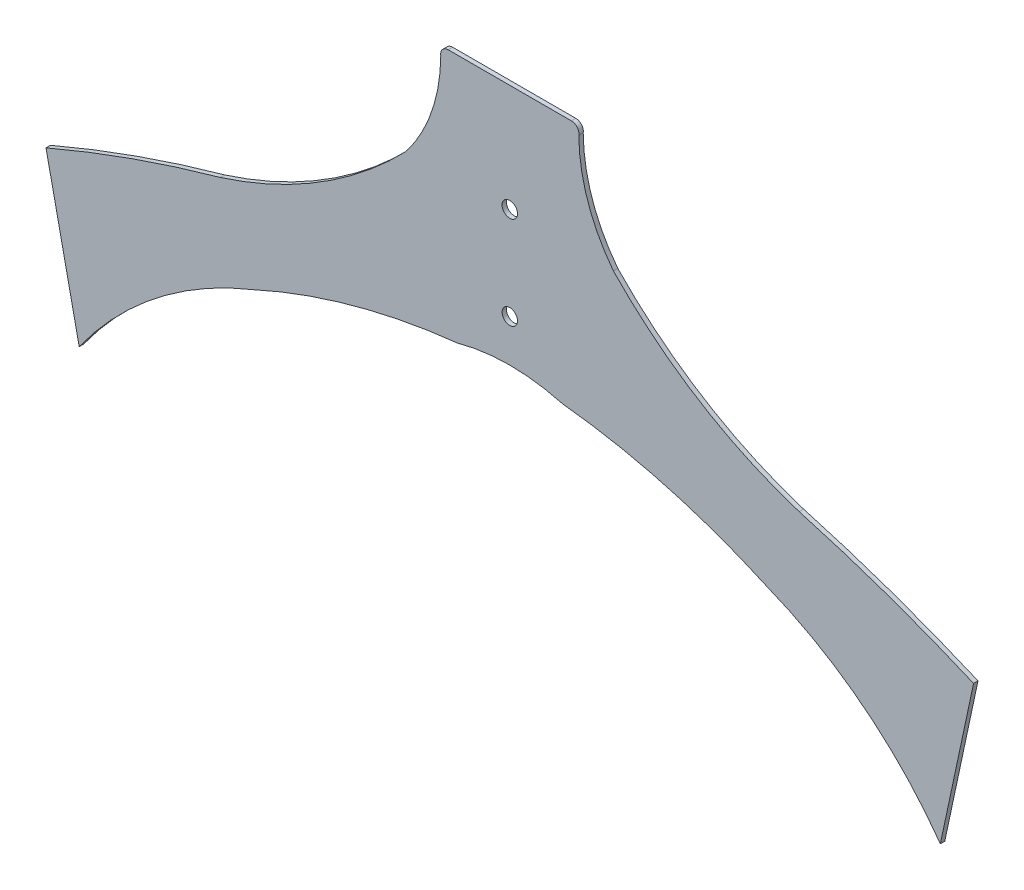
ISO-10303-21;
HEADER;
FILE_DESCRIPTION(('STEP AP214'),'2;1');
FILE_NAME('part.step','',(''),(''),'','','');
FILE_SCHEMA(('AUTOMOTIVE_DESIGN { 1 0 10303 214 1 1 1 1 }'));
ENDSEC;
DATA;
#1=APPLICATION_CONTEXT('core data for automotive mechanical design processes');
#2=APPLICATION_PROTOCOL_DEFINITION('international standard','automotive_design',2000,#1);
#3=PRODUCT_CONTEXT('',#1,'mechanical');
#4=PRODUCT('Part','Part','',(#3));
#5=PRODUCT_RELATED_PRODUCT_CATEGORY('part','',(#4));
#6=PRODUCT_DEFINITION_FORMATION('','',#4);
#7=PRODUCT_DEFINITION_CONTEXT('part definition',#1,'design');
#8=PRODUCT_DEFINITION('design','',#6,#7);
#9=PRODUCT_DEFINITION_SHAPE('','',#8);
#10=(LENGTH_UNIT() NAMED_UNIT(*) SI_UNIT(.MILLI.,.METRE.));
#11=(NAMED_UNIT(*) PLANE_ANGLE_UNIT() SI_UNIT($,.RADIAN.));
#12=(NAMED_UNIT(*) SI_UNIT($,.STERADIAN.) SOLID_ANGLE_UNIT());
#13=UNCERTAINTY_MEASURE_WITH_UNIT(LENGTH_MEASURE(1.E-05),#10,'distance_accuracy_value','');
#14=(GEOMETRIC_REPRESENTATION_CONTEXT(3) GLOBAL_UNCERTAINTY_ASSIGNED_CONTEXT((#13)) GLOBAL_UNIT_ASSIGNED_CONTEXT((#10,
#11,#12)) REPRESENTATION_CONTEXT('',''));
#15=CARTESIAN_POINT('',(0.,0.,0.));
#16=DIRECTION('',(0.,0.,1.));
#17=DIRECTION('',(1.,0.,0.));
#18=AXIS2_PLACEMENT_3D('',#15,#16,#17);
#19=CARTESIAN_POINT('',(-681.623414978373,723.91457598848,0.));
#20=DIRECTION('',(-0.9779411440759,-0.208880632715241,0.));
#21=DIRECTION('',(0.208880632715241,-0.9779411440759,0.));
#22=AXIS2_PLACEMENT_3D('',#19,#20,#21);
#23=PLANE('',#22);
#24=DIRECTION('',(0.208880632715241,-0.9779411440759,0.));
#25=VECTOR('',#24,1.);
#26=CARTESIAN_POINT('',(-124.231516897274,-1885.69294684576,6.35));
#27=LINE('',#26,#25);
#28=CARTESIAN_POINT('',(-666.564137408614,653.409776457336,6.35));
#29=VERTEX_POINT('',#28);
#30=CARTESIAN_POINT('',(-618.800167532141,429.787553853849,6.35));
#31=VERTEX_POINT('',#30);
#32=EDGE_CURVE('E313',#29,#31,#27,.T.);
#33=ORIENTED_EDGE('',*,*,#32,.F.);
#34=DIRECTION('',(0.,0.,-1.));
#35=VECTOR('',#34,1.);
#36=CARTESIAN_POINT('',(-666.564137408614,653.409776457336,6.35));
#37=LINE('',#36,#35);
#38=CARTESIAN_POINT('',(-666.564137408614,653.409776457336,0.));
#39=VERTEX_POINT('',#38);
#40=EDGE_CURVE('E44',#29,#39,#37,.T.);
#41=ORIENTED_EDGE('',*,*,#40,.T.);
#42=DIRECTION('',(0.208880632715241,-0.9779411440759,0.));
#43=VECTOR('',#42,1.);
#44=CARTESIAN_POINT('',(-124.231516897274,-1885.69294684576,0.));
#45=LINE('',#44,#43);
#46=CARTESIAN_POINT('',(-618.800167532141,429.787553853849,0.));
#47=VERTEX_POINT('',#46);
#48=EDGE_CURVE('E49',#39,#47,#45,.T.);
#49=ORIENTED_EDGE('',*,*,#48,.T.);
#50=DIRECTION('',(0.,0.,-1.));
#51=VECTOR('',#50,1.);
#52=CARTESIAN_POINT('',(-618.800167532141,429.787553853849,6.35));
#53=LINE('',#52,#51);
#54=EDGE_CURVE('E316',#31,#47,#53,.T.);
#55=ORIENTED_EDGE('',*,*,#54,.F.);
#56=EDGE_LOOP('',(#33,#41,#49,#55));
#57=FACE_BOUND('',#56,.T.);
#58=ADVANCED_FACE('F40',(#57),#23,.T.);
#59=CARTESIAN_POINT('',(681.623414978373,723.91457598848,0.));
#60=DIRECTION('',(0.9779411440759,-0.208880632715241,0.));
#61=DIRECTION('',(-0.208880632715241,-0.9779411440759,0.));
#62=AXIS2_PLACEMENT_3D('',#59,#60,#61);
#63=PLANE('',#62);
#64=DIRECTION('',(0.208880632715241,0.9779411440759,0.));
#65=VECTOR('',#64,1.);
#66=CARTESIAN_POINT('',(117.384536046517,-1917.74926628339,0.));
#67=LINE('',#66,#65);
#68=CARTESIAN_POINT('',(618.800167532119,429.787553853746,0.));
#69=VERTEX_POINT('',#68);
#70=CARTESIAN_POINT('',(666.564137408584,653.409776457198,0.));
#71=VERTEX_POINT('',#70);
#72=EDGE_CURVE('E11',#69,#71,#67,.T.);
#73=ORIENTED_EDGE('',*,*,#72,.T.);
#74=DIRECTION('',(0.,0.,-1.));
#75=VECTOR('',#74,1.);
#76=CARTESIAN_POINT('',(666.564137408585,653.409776457197,6.35));
#77=LINE('',#76,#75);
#78=CARTESIAN_POINT('',(666.564137408584,653.409776457198,6.35));
#79=VERTEX_POINT('',#78);
#80=EDGE_CURVE('E319',#71,#79,#77,.F.);
#81=ORIENTED_EDGE('',*,*,#80,.T.);
#82=DIRECTION('',(0.208880632715241,0.9779411440759,0.));
#83=VECTOR('',#82,1.);
#84=CARTESIAN_POINT('',(117.384536046517,-1917.74926628339,6.35));
#85=LINE('',#84,#83);
#86=CARTESIAN_POINT('',(618.800167532119,429.787553853746,6.35));
#87=VERTEX_POINT('',#86);
#88=EDGE_CURVE('E300',#87,#79,#85,.T.);
#89=ORIENTED_EDGE('',*,*,#88,.F.);
#90=DIRECTION('',(0.,0.,-1.));
#91=VECTOR('',#90,1.);
#92=CARTESIAN_POINT('',(618.800167532119,429.787553853746,6.35));
#93=LINE('',#92,#91);
#94=EDGE_CURVE('E317',#69,#87,#93,.F.);
#95=ORIENTED_EDGE('',*,*,#94,.F.);
#96=EDGE_LOOP('',(#73,#81,#89,#95));
#97=FACE_BOUND('',#96,.T.);
#98=ADVANCED_FACE('F42',(#97),#63,.T.);
#99=CARTESIAN_POINT('',(-160.827756363036,102.888433076201,6.35));
#100=DIRECTION('',(0.,0.,-1.));
#101=DIRECTION('',(-1.,0.,0.));
#102=AXIS2_PLACEMENT_3D('',#99,#100,#101);
#103=CYLINDRICAL_SURFACE('',#102,562.673763878541);
#104=CARTESIAN_POINT('',(-160.827756363036,102.888433076201,6.35));
#105=DIRECTION('',(0.,0.,1.));
#106=DIRECTION('',(1.,0.,0.));
#107=AXIS2_PLACEMENT_3D('',#104,#105,#106);
#108=CIRCLE('',#107,562.673763878541);
#109=CARTESIAN_POINT('',(-369.931782025196,625.264993623274,6.35));
#110=VERTEX_POINT('',#109);
#111=EDGE_CURVE('E203',#110,#31,#108,.T.);
#112=ORIENTED_EDGE('',*,*,#111,.T.);
#113=ORIENTED_EDGE('',*,*,#54,.T.);
#114=CARTESIAN_POINT('',(-160.827756363036,102.888433076201,0.));
#115=DIRECTION('',(0.,0.,1.));
#116=DIRECTION('',(1.,0.,0.));
#117=AXIS2_PLACEMENT_3D('',#114,#115,#116);
#118=CIRCLE('',#117,562.673763878541);
#119=CARTESIAN_POINT('',(-369.931782025196,625.264993623274,0.));
#120=VERTEX_POINT('',#119);
#121=EDGE_CURVE('E60',#120,#47,#118,.T.);
#122=ORIENTED_EDGE('',*,*,#121,.F.);
#123=DIRECTION('',(0.,0.,-1.));
#124=VECTOR('',#123,1.);
#125=CARTESIAN_POINT('',(-369.931782025196,625.264993623274,6.35));
#126=LINE('',#125,#124);
#127=EDGE_CURVE('E302',#110,#120,#126,.T.);
#128=ORIENTED_EDGE('',*,*,#127,.F.);
#129=EDGE_LOOP('',(#112,#113,#122,#128));
#130=FACE_BOUND('',#129,.T.);
#131=ADVANCED_FACE('F324',(#130),#103,.F.);
#132=CARTESIAN_POINT('',(26.0755874301815,-241.040177806366,6.35));
#133=DIRECTION('',(0.,0.,-1.));
#134=DIRECTION('',(-1.,0.,0.));
#135=AXIS2_PLACEMENT_3D('',#132,#133,#134);
#136=CYLINDRICAL_SURFACE('',#135,952.526370610655);
#137=CARTESIAN_POINT('',(26.0755874301815,-241.040177806366,0.));
#138=DIRECTION('',(0.,0.,1.));
#139=DIRECTION('',(1.,0.,0.));
#140=AXIS2_PLACEMENT_3D('',#137,#138,#139);
#141=CIRCLE('',#140,952.526370610655);
#142=CARTESIAN_POINT('',(-75.4328871101375,706.061990022007,0.));
#143=VERTEX_POINT('',#142);
#144=EDGE_CURVE('E250',#143,#120,#141,.T.);
#145=ORIENTED_EDGE('',*,*,#144,.F.);
#146=DIRECTION('',(0.,0.,-1.));
#147=VECTOR('',#146,1.);
#148=CARTESIAN_POINT('',(-75.4328871101375,706.061990022007,6.35));
#149=LINE('',#148,#147);
#150=CARTESIAN_POINT('',(-75.4328871101375,706.061990022007,6.35));
#151=VERTEX_POINT('',#150);
#152=EDGE_CURVE('E238',#151,#143,#149,.T.);
#153=ORIENTED_EDGE('',*,*,#152,.F.);
#154=CARTESIAN_POINT('',(26.0755874301815,-241.040177806366,6.35));
#155=DIRECTION('',(0.,0.,1.));
#156=DIRECTION('',(1.,0.,0.));
#157=AXIS2_PLACEMENT_3D('',#154,#155,#156);
#158=CIRCLE('',#157,952.526370610655);
#159=EDGE_CURVE('E191',#151,#110,#158,.T.);
#160=ORIENTED_EDGE('',*,*,#159,.T.);
#161=ORIENTED_EDGE('',*,*,#127,.T.);
#162=EDGE_LOOP('',(#145,#153,#160,#161));
#163=FACE_BOUND('',#162,.T.);
#164=ADVANCED_FACE('F374',(#163),#136,.F.);
#165=CARTESIAN_POINT('',(0.566432275279638,427.947762650832,6.35));
#166=DIRECTION('',(0.,0.,-1.));
#167=DIRECTION('',(-1.,0.,0.));
#168=AXIS2_PLACEMENT_3D('',#165,#166,#167);
#169=CYLINDRICAL_SURFACE('',#168,288.311324809401);
#170=CARTESIAN_POINT('',(0.566432275279638,427.947762650832,0.));
#171=DIRECTION('',(0.,0.,1.));
#172=DIRECTION('',(1.,0.,0.));
#173=AXIS2_PLACEMENT_3D('',#170,#171,#172);
#174=CIRCLE('',#173,288.311324809401);
#175=CARTESIAN_POINT('',(-6.71242319540133E-08,716.258531037574,0.));
#176=VERTEX_POINT('',#175);
#177=EDGE_CURVE('E174',#176,#143,#174,.T.);
#178=ORIENTED_EDGE('',*,*,#177,.F.);
#179=DIRECTION('',(0.,0.,-1.));
#180=VECTOR('',#179,1.);
#181=CARTESIAN_POINT('',(-6.71242319540133E-08,716.258531037574,6.35));
#182=LINE('',#181,#180);
#183=CARTESIAN_POINT('',(-6.71242319540133E-08,716.258531037574,6.35));
#184=VERTEX_POINT('',#183);
#185=EDGE_CURVE('E168',#184,#176,#182,.T.);
#186=ORIENTED_EDGE('',*,*,#185,.F.);
#187=CARTESIAN_POINT('',(0.566432275279638,427.947762650832,6.35));
#188=DIRECTION('',(0.,0.,1.));
#189=DIRECTION('',(1.,0.,0.));
#190=AXIS2_PLACEMENT_3D('',#187,#188,#189);
#191=CIRCLE('',#190,288.311324809401);
#192=EDGE_CURVE('E171',#184,#151,#191,.T.);
#193=ORIENTED_EDGE('',*,*,#192,.T.);
#194=ORIENTED_EDGE('',*,*,#152,.T.);
#195=EDGE_LOOP('',(#178,#186,#193,#194));
#196=FACE_BOUND('',#195,.T.);
#197=ADVANCED_FACE('F170',(#196),#169,.F.);
#198=CARTESIAN_POINT('',(-0.566432275373785,427.947762650831,6.35));
#199=DIRECTION('',(0.,0.,-1.));
#200=DIRECTION('',(-1.,0.,0.));
#201=AXIS2_PLACEMENT_3D('',#198,#199,#200);
#202=CYLINDRICAL_SURFACE('',#201,288.311324809138);
#203=CARTESIAN_POINT('',(-0.566432275373785,427.947762650831,0.));
#204=DIRECTION('',(0.,0.,1.));
#205=DIRECTION('',(1.,0.,0.));
#206=AXIS2_PLACEMENT_3D('',#203,#204,#205);
#207=CIRCLE('',#206,288.311324809138);
#208=CARTESIAN_POINT('',(75.4328871083257,706.061990022192,0.));
#209=VERTEX_POINT('',#208);
#210=EDGE_CURVE('E240',#209,#176,#207,.T.);
#211=ORIENTED_EDGE('',*,*,#210,.F.);
#212=DIRECTION('',(0.,0.,-1.));
#213=VECTOR('',#212,1.);
#214=CARTESIAN_POINT('',(75.4328871083257,706.061990022192,6.35));
#215=LINE('',#214,#213);
#216=CARTESIAN_POINT('',(75.4328871083257,706.061990022192,6.35));
#217=VERTEX_POINT('',#216);
#218=EDGE_CURVE('E180',#217,#209,#215,.T.);
#219=ORIENTED_EDGE('',*,*,#218,.F.);
#220=CARTESIAN_POINT('',(-0.566432275373785,427.947762650831,6.35));
#221=DIRECTION('',(0.,0.,1.));
#222=DIRECTION('',(1.,0.,0.));
#223=AXIS2_PLACEMENT_3D('',#220,#221,#222);
#224=CIRCLE('',#223,288.311324809138);
#225=EDGE_CURVE('E187',#217,#184,#224,.T.);
#226=ORIENTED_EDGE('',*,*,#225,.T.);
#227=ORIENTED_EDGE('',*,*,#185,.T.);
#228=EDGE_LOOP('',(#211,#219,#226,#227));
#229=FACE_BOUND('',#228,.T.);
#230=ADVANCED_FACE('F194',(#229),#202,.F.);
#231=CARTESIAN_POINT('',(-26.0755874302774,-241.040177806365,6.35));
#232=DIRECTION('',(0.,0.,-1.));
#233=DIRECTION('',(-1.,0.,0.));
#234=AXIS2_PLACEMENT_3D('',#231,#232,#233);
#235=CYLINDRICAL_SURFACE('',#234,952.526370610655);
#236=CARTESIAN_POINT('',(-26.0755874302774,-241.040177806365,0.));
#237=DIRECTION('',(0.,0.,1.));
#238=DIRECTION('',(1.,0.,0.));
#239=AXIS2_PLACEMENT_3D('',#236,#237,#238);
#240=CIRCLE('',#239,952.526370610655);
#241=CARTESIAN_POINT('',(369.931782025103,625.264993623274,0.));
#242=VERTEX_POINT('',#241);
#243=EDGE_CURVE('E242',#242,#209,#240,.T.);
#244=ORIENTED_EDGE('',*,*,#243,.F.);
#245=DIRECTION('',(0.,0.,-1.));
#246=VECTOR('',#245,1.);
#247=CARTESIAN_POINT('',(369.931782025103,625.264993623274,6.35));
#248=LINE('',#247,#246);
#249=CARTESIAN_POINT('',(369.931782025103,625.264993623274,6.35));
#250=VERTEX_POINT('',#249);
#251=EDGE_CURVE('E304',#250,#242,#248,.T.);
#252=ORIENTED_EDGE('',*,*,#251,.F.);
#253=CARTESIAN_POINT('',(-26.0755874302774,-241.040177806365,6.35));
#254=DIRECTION('',(0.,0.,1.));
#255=DIRECTION('',(1.,0.,0.));
#256=AXIS2_PLACEMENT_3D('',#253,#254,#255);
#257=CIRCLE('',#256,952.526370610655);
#258=EDGE_CURVE('E195',#250,#217,#257,.T.);
#259=ORIENTED_EDGE('',*,*,#258,.T.);
#260=ORIENTED_EDGE('',*,*,#218,.T.);
#261=EDGE_LOOP('',(#244,#252,#259,#260));
#262=FACE_BOUND('',#261,.T.);
#263=ADVANCED_FACE('F371',(#262),#235,.F.);
#264=CARTESIAN_POINT('',(160.827756362941,102.8884330762,6.35));
#265=DIRECTION('',(0.,0.,-1.));
#266=DIRECTION('',(-1.,0.,0.));
#267=AXIS2_PLACEMENT_3D('',#264,#265,#266);
#268=CYLINDRICAL_SURFACE('',#267,562.673763878539);
#269=CARTESIAN_POINT('',(160.827756362941,102.8884330762,0.));
#270=DIRECTION('',(0.,0.,1.));
#271=DIRECTION('',(1.,0.,0.));
#272=AXIS2_PLACEMENT_3D('',#269,#270,#271);
#273=CIRCLE('',#272,562.673763878539);
#274=EDGE_CURVE('E68',#69,#242,#273,.T.);
#275=ORIENTED_EDGE('',*,*,#274,.F.);
#276=ORIENTED_EDGE('',*,*,#94,.T.);
#277=CARTESIAN_POINT('',(160.827756362941,102.8884330762,6.35));
#278=DIRECTION('',(0.,0.,1.));
#279=DIRECTION('',(1.,0.,0.));
#280=AXIS2_PLACEMENT_3D('',#277,#278,#279);
#281=CIRCLE('',#280,562.673763878539);
#282=EDGE_CURVE('E198',#87,#250,#281,.T.);
#283=ORIENTED_EDGE('',*,*,#282,.T.);
#284=ORIENTED_EDGE('',*,*,#251,.T.);
#285=EDGE_LOOP('',(#275,#276,#283,#284));
#286=FACE_BOUND('',#285,.T.);
#287=ADVANCED_FACE('F367',(#286),#268,.F.);
#288=CARTESIAN_POINT('',(-119.286980797789,-1174.67945800023,6.35));
#289=DIRECTION('',(0.,0.,-1.));
#290=DIRECTION('',(-1.,0.,0.));
#291=AXIS2_PLACEMENT_3D('',#288,#289,#290);
#292=CYLINDRICAL_SURFACE('',#291,1989.84226237291);
#293=ORIENTED_EDGE('',*,*,#80,.F.);
#294=CARTESIAN_POINT('',(-119.286980797789,-1174.67945800023,0.));
#295=DIRECTION('',(0.,0.,1.));
#296=DIRECTION('',(1.,0.,0.));
#297=AXIS2_PLACEMENT_3D('',#294,#295,#296);
#298=CIRCLE('',#297,1989.84226237291);
#299=CARTESIAN_POINT('',(415.96668609178,741.821452828309,0.));
#300=VERTEX_POINT('',#299);
#301=EDGE_CURVE('E252',#71,#300,#298,.T.);
#302=ORIENTED_EDGE('',*,*,#301,.T.);
#303=DIRECTION('',(0.,0.,-1.));
#304=VECTOR('',#303,1.);
#305=CARTESIAN_POINT('',(415.96668609178,741.821452828309,6.35));
#306=LINE('',#305,#304);
#307=CARTESIAN_POINT('',(415.96668609178,741.821452828309,6.35));
#308=VERTEX_POINT('',#307);
#309=EDGE_CURVE('E297',#308,#300,#306,.T.);
#310=ORIENTED_EDGE('',*,*,#309,.F.);
#311=CARTESIAN_POINT('',(-119.286980797789,-1174.67945800023,6.35));
#312=DIRECTION('',(0.,0.,1.));
#313=DIRECTION('',(1.,0.,0.));
#314=AXIS2_PLACEMENT_3D('',#311,#312,#313);
#315=CIRCLE('',#314,1989.84226237291);
#316=EDGE_CURVE('E208',#79,#308,#315,.T.);
#317=ORIENTED_EDGE('',*,*,#316,.F.);
#318=EDGE_LOOP('',(#293,#302,#310,#317));
#319=FACE_BOUND('',#318,.T.);
#320=ADVANCED_FACE('F364',(#319),#292,.T.);
#321=CARTESIAN_POINT('',(608.61717366582,1349.33678729928,6.35));
#322=DIRECTION('',(0.,0.,-1.));
#323=DIRECTION('',(-1.,0.,0.));
#324=AXIS2_PLACEMENT_3D('',#321,#322,#323);
#325=CYLINDRICAL_SURFACE('',#324,637.329657226072);
#326=CARTESIAN_POINT('',(608.61717366582,1349.33678729928,0.));
#327=DIRECTION('',(0.,0.,1.));
#328=DIRECTION('',(1.,0.,0.));
#329=AXIS2_PLACEMENT_3D('',#326,#327,#328);
#330=CIRCLE('',#329,637.329657226072);
#331=CARTESIAN_POINT('',(148.991396909896,907.824344301995,0.));
#332=VERTEX_POINT('',#331);
#333=EDGE_CURVE('E254',#332,#300,#330,.T.);
#334=ORIENTED_EDGE('',*,*,#333,.F.);
#335=DIRECTION('',(0.,0.,-1.));
#336=VECTOR('',#335,1.);
#337=CARTESIAN_POINT('',(148.991396909896,907.824344301995,6.35));
#338=LINE('',#337,#336);
#339=CARTESIAN_POINT('',(148.991396909896,907.824344301995,6.35));
#340=VERTEX_POINT('',#339);
#341=EDGE_CURVE('E295',#340,#332,#338,.T.);
#342=ORIENTED_EDGE('',*,*,#341,.F.);
#343=CARTESIAN_POINT('',(608.61717366582,1349.33678729928,6.35));
#344=DIRECTION('',(0.,0.,1.));
#345=DIRECTION('',(1.,0.,0.));
#346=AXIS2_PLACEMENT_3D('',#343,#344,#345);
#347=CIRCLE('',#346,637.329657226072);
#348=EDGE_CURVE('E210',#340,#308,#347,.T.);
#349=ORIENTED_EDGE('',*,*,#348,.T.);
#350=ORIENTED_EDGE('',*,*,#309,.T.);
#351=EDGE_LOOP('',(#334,#342,#349,#350));
#352=FACE_BOUND('',#351,.T.);
#353=ADVANCED_FACE('F358',(#352),#325,.F.);
#354=CARTESIAN_POINT('',(336.560068431435,1053.34668363406,6.35));
#355=DIRECTION('',(0.,0.,-1.));
#356=DIRECTION('',(-1.,0.,0.));
#357=AXIS2_PLACEMENT_3D('',#354,#355,#356);
#358=CYLINDRICAL_SURFACE('',#357,237.399995326522);
#359=CARTESIAN_POINT('',(336.560068431435,1053.34668363406,0.));
#360=DIRECTION('',(0.,0.,1.));
#361=DIRECTION('',(1.,0.,0.));
#362=AXIS2_PLACEMENT_3D('',#359,#360,#361);
#363=CIRCLE('',#362,237.399995326522);
#364=CARTESIAN_POINT('',(99.1657070642921,1051.71114943347,0.));
#365=VERTEX_POINT('',#364);
#366=EDGE_CURVE('E257',#365,#332,#363,.T.);
#367=ORIENTED_EDGE('',*,*,#366,.F.);
#368=DIRECTION('',(0.,0.,-1.));
#369=VECTOR('',#368,1.);
#370=CARTESIAN_POINT('',(99.1657070642921,1051.71114943347,6.35));
#371=LINE('',#370,#369);
#372=CARTESIAN_POINT('',(99.1657070642921,1051.71114943347,6.35));
#373=VERTEX_POINT('',#372);
#374=EDGE_CURVE('E293',#373,#365,#371,.T.);
#375=ORIENTED_EDGE('',*,*,#374,.F.);
#376=CARTESIAN_POINT('',(336.560068431435,1053.34668363406,6.35));
#377=DIRECTION('',(0.,0.,1.));
#378=DIRECTION('',(1.,0.,0.));
#379=AXIS2_PLACEMENT_3D('',#376,#377,#378);
#380=CIRCLE('',#379,237.399995326522);
#381=EDGE_CURVE('E213',#373,#340,#380,.T.);
#382=ORIENTED_EDGE('',*,*,#381,.T.);
#383=ORIENTED_EDGE('',*,*,#341,.T.);
#384=EDGE_LOOP('',(#367,#375,#382,#383));
#385=FACE_BOUND('',#384,.T.);
#386=ADVANCED_FACE('F353',(#385),#358,.F.);
#387=CARTESIAN_POINT('',(88.5396301304286,1053.70584198852,6.35));
#388=DIRECTION('',(0.,0.,-1.));
#389=DIRECTION('',(-1.,0.,0.));
#390=AXIS2_PLACEMENT_3D('',#387,#388,#389);
#391=CYLINDRICAL_SURFACE('',#390,10.8116746803422);
#392=CARTESIAN_POINT('',(88.5396301304286,1053.70584198852,0.));
#393=DIRECTION('',(0.,0.,1.));
#394=DIRECTION('',(1.,0.,0.));
#395=AXIS2_PLACEMENT_3D('',#392,#393,#394);
#396=CIRCLE('',#395,10.8116746803422);
#397=CARTESIAN_POINT('',(88.5396301304304,1064.51751666886,0.));
#398=VERTEX_POINT('',#397);
#399=EDGE_CURVE('E260',#365,#398,#396,.T.);
#400=ORIENTED_EDGE('',*,*,#399,.T.);
#401=DIRECTION('',(0.,0.,-1.));
#402=VECTOR('',#401,1.);
#403=CARTESIAN_POINT('',(88.5396301304304,1064.51751666886,6.35));
#404=LINE('',#403,#402);
#405=CARTESIAN_POINT('',(88.5396301304304,1064.51751666886,6.35));
#406=VERTEX_POINT('',#405);
#407=EDGE_CURVE('E290',#406,#398,#404,.T.);
#408=ORIENTED_EDGE('',*,*,#407,.F.);
#409=CARTESIAN_POINT('',(88.5396301304286,1053.70584198852,6.35));
#410=DIRECTION('',(0.,0.,1.));
#411=DIRECTION('',(1.,0.,0.));
#412=AXIS2_PLACEMENT_3D('',#409,#410,#411);
#413=CIRCLE('',#412,10.8116746803422);
#414=EDGE_CURVE('E216',#373,#406,#413,.T.);
#415=ORIENTED_EDGE('',*,*,#414,.F.);
#416=ORIENTED_EDGE('',*,*,#374,.T.);
#417=EDGE_LOOP('',(#400,#408,#415,#416));
#418=FACE_BOUND('',#417,.T.);
#419=ADVANCED_FACE('F350',(#418),#391,.T.);
#420=CARTESIAN_POINT('',(-78.4644200174974,1064.51751666889,6.35));
#421=DIRECTION('',(-1.79155600765889E-13,-1.,0.));
#422=DIRECTION('',(1.,-1.79155600765889E-13,0.));
#423=AXIS2_PLACEMENT_3D('',#420,#421,#422);
#424=PLANE('',#423);
#425=DIRECTION('',(-1.,1.79155600765889E-13,0.));
#426=VECTOR('',#425,1.);
#427=CARTESIAN_POINT('',(-78.4644200174974,1064.51751666889,0.));
#428=LINE('',#427,#426);
#429=CARTESIAN_POINT('',(-88.5396301306205,1064.51751666897,0.));
#430=VERTEX_POINT('',#429);
#431=EDGE_CURVE('E263',#398,#430,#428,.T.);
#432=ORIENTED_EDGE('',*,*,#431,.T.);
#433=DIRECTION('',(0.,0.,-1.));
#434=VECTOR('',#433,1.);
#435=CARTESIAN_POINT('',(-88.5396301306205,1064.51751666897,6.35));
#436=LINE('',#435,#434);
#437=CARTESIAN_POINT('',(-88.5396301306205,1064.51751666897,6.35));
#438=VERTEX_POINT('',#437);
#439=EDGE_CURVE('E287',#438,#430,#436,.T.);
#440=ORIENTED_EDGE('',*,*,#439,.F.);
#441=DIRECTION('',(-1.,1.79155600765889E-13,0.));
#442=VECTOR('',#441,1.);
#443=CARTESIAN_POINT('',(-78.4644200174974,1064.51751666889,6.35));
#444=LINE('',#443,#442);
#445=EDGE_CURVE('E219',#406,#438,#444,.T.);
#446=ORIENTED_EDGE('',*,*,#445,.F.);
#447=ORIENTED_EDGE('',*,*,#407,.T.);
#448=EDGE_LOOP('',(#432,#440,#446,#447));
#449=FACE_BOUND('',#448,.T.);
#450=ADVANCED_FACE('F346',(#449),#424,.F.);
#451=CARTESIAN_POINT('',(-88.5396301306205,1053.70584198862,6.35));
#452=DIRECTION('',(0.,0.,-1.));
#453=DIRECTION('',(-1.,0.,0.));
#454=AXIS2_PLACEMENT_3D('',#451,#452,#453);
#455=CYLINDRICAL_SURFACE('',#454,10.8116746803424);
#456=CARTESIAN_POINT('',(-88.5396301306205,1053.70584198862,0.));
#457=DIRECTION('',(0.,0.,1.));
#458=DIRECTION('',(1.,0.,0.));
#459=AXIS2_PLACEMENT_3D('',#456,#457,#458);
#460=CIRCLE('',#459,10.8116746803424);
#461=CARTESIAN_POINT('',(-99.1657070644843,1051.71114943357,0.));
#462=VERTEX_POINT('',#461);
#463=EDGE_CURVE('E266',#430,#462,#460,.T.);
#464=ORIENTED_EDGE('',*,*,#463,.T.);
#465=DIRECTION('',(0.,0.,-1.));
#466=VECTOR('',#465,1.);
#467=CARTESIAN_POINT('',(-99.1657070644843,1051.71114943357,6.35));
#468=LINE('',#467,#466);
#469=CARTESIAN_POINT('',(-99.1657070644843,1051.71114943357,6.35));
#470=VERTEX_POINT('',#469);
#471=EDGE_CURVE('E285',#470,#462,#468,.T.);
#472=ORIENTED_EDGE('',*,*,#471,.F.);
#473=CARTESIAN_POINT('',(-88.5396301306205,1053.70584198862,6.35));
#474=DIRECTION('',(0.,0.,1.));
#475=DIRECTION('',(1.,0.,0.));
#476=AXIS2_PLACEMENT_3D('',#473,#474,#475);
#477=CIRCLE('',#476,10.8116746803424);
#478=EDGE_CURVE('E222',#438,#470,#477,.T.);
#479=ORIENTED_EDGE('',*,*,#478,.F.);
#480=ORIENTED_EDGE('',*,*,#439,.T.);
#481=EDGE_LOOP('',(#464,#472,#479,#480));
#482=FACE_BOUND('',#481,.T.);
#483=ADVANCED_FACE('F344',(#482),#455,.T.);
#484=CARTESIAN_POINT('',(-336.560068431623,1053.34668363417,6.35));
#485=DIRECTION('',(0.,0.,-1.));
#486=DIRECTION('',(-1.,0.,0.));
#487=AXIS2_PLACEMENT_3D('',#484,#485,#486);
#488=CYLINDRICAL_SURFACE('',#487,237.399995326524);
#489=CARTESIAN_POINT('',(-336.560068431623,1053.34668363417,0.));
#490=DIRECTION('',(0.,0.,1.));
#491=DIRECTION('',(1.,0.,0.));
#492=AXIS2_PLACEMENT_3D('',#489,#490,#491);
#493=CIRCLE('',#492,237.399995326524);
#494=CARTESIAN_POINT('',(-148.991396910188,907.824344301967,0.));
#495=VERTEX_POINT('',#494);
#496=EDGE_CURVE('E269',#495,#462,#493,.T.);
#497=ORIENTED_EDGE('',*,*,#496,.F.);
#498=DIRECTION('',(0.,0.,-1.));
#499=VECTOR('',#498,1.);
#500=CARTESIAN_POINT('',(-148.991396910188,907.824344301967,6.35));
#501=LINE('',#500,#499);
#502=CARTESIAN_POINT('',(-148.991396910188,907.824344301967,6.35));
#503=VERTEX_POINT('',#502);
#504=EDGE_CURVE('E283',#503,#495,#501,.T.);
#505=ORIENTED_EDGE('',*,*,#504,.F.);
#506=CARTESIAN_POINT('',(-336.560068431623,1053.34668363417,6.35));
#507=DIRECTION('',(0.,0.,1.));
#508=DIRECTION('',(1.,0.,0.));
#509=AXIS2_PLACEMENT_3D('',#506,#507,#508);
#510=CIRCLE('',#509,237.399995326524);
#511=EDGE_CURVE('E224',#503,#470,#510,.T.);
#512=ORIENTED_EDGE('',*,*,#511,.T.);
#513=ORIENTED_EDGE('',*,*,#471,.T.);
#514=EDGE_LOOP('',(#497,#505,#512,#513));
#515=FACE_BOUND('',#514,.T.);
#516=ADVANCED_FACE('F339',(#515),#488,.F.);
#517=CARTESIAN_POINT('',(-608.617173665994,1349.33678729937,6.35));
#518=DIRECTION('',(0.,0.,-1.));
#519=DIRECTION('',(-1.,0.,0.));
#520=AXIS2_PLACEMENT_3D('',#517,#518,#519);
#521=CYLINDRICAL_SURFACE('',#520,637.329657226082);
#522=CARTESIAN_POINT('',(-608.617173665994,1349.33678729937,0.));
#523=DIRECTION('',(0.,0.,1.));
#524=DIRECTION('',(1.,0.,0.));
#525=AXIS2_PLACEMENT_3D('',#522,#523,#524);
#526=CIRCLE('',#525,637.329657226082);
#527=CARTESIAN_POINT('',(-415.966686091993,741.821452828369,0.));
#528=VERTEX_POINT('',#527);
#529=EDGE_CURVE('E272',#528,#495,#526,.T.);
#530=ORIENTED_EDGE('',*,*,#529,.F.);
#531=DIRECTION('',(0.,0.,-1.));
#532=VECTOR('',#531,1.);
#533=CARTESIAN_POINT('',(-415.966686091993,741.821452828369,6.35));
#534=LINE('',#533,#532);
#535=CARTESIAN_POINT('',(-415.966686091993,741.821452828369,6.35));
#536=VERTEX_POINT('',#535);
#537=EDGE_CURVE('E179',#536,#528,#534,.T.);
#538=ORIENTED_EDGE('',*,*,#537,.F.);
#539=CARTESIAN_POINT('',(-608.617173665994,1349.33678729937,6.35));
#540=DIRECTION('',(0.,0.,1.));
#541=DIRECTION('',(1.,0.,0.));
#542=AXIS2_PLACEMENT_3D('',#539,#540,#541);
#543=CIRCLE('',#542,637.329657226082);
#544=EDGE_CURVE('E227',#536,#503,#543,.T.);
#545=ORIENTED_EDGE('',*,*,#544,.T.);
#546=ORIENTED_EDGE('',*,*,#504,.T.);
#547=EDGE_LOOP('',(#530,#538,#545,#546));
#548=FACE_BOUND('',#547,.T.);
#549=ADVANCED_FACE('F333',(#548),#521,.F.);
#550=CARTESIAN_POINT('',(119.286980797572,-1174.67945800018,6.35));
#551=DIRECTION('',(0.,0.,-1.));
#552=DIRECTION('',(-1.,0.,0.));
#553=AXIS2_PLACEMENT_3D('',#550,#551,#552);
#554=CYLINDRICAL_SURFACE('',#553,1989.84226237292);
#555=ORIENTED_EDGE('',*,*,#40,.F.);
#556=CARTESIAN_POINT('',(119.286980797572,-1174.67945800018,6.35));
#557=DIRECTION('',(0.,0.,1.));
#558=DIRECTION('',(1.,0.,0.));
#559=AXIS2_PLACEMENT_3D('',#556,#557,#558);
#560=CIRCLE('',#559,1989.84226237292);
#561=EDGE_CURVE('E230',#536,#29,#560,.T.);
#562=ORIENTED_EDGE('',*,*,#561,.F.);
#563=ORIENTED_EDGE('',*,*,#537,.T.);
#564=CARTESIAN_POINT('',(119.286980797572,-1174.67945800018,0.));
#565=DIRECTION('',(0.,0.,1.));
#566=DIRECTION('',(1.,0.,0.));
#567=AXIS2_PLACEMENT_3D('',#564,#565,#566);
#568=CIRCLE('',#567,1989.84226237292);
#569=EDGE_CURVE('E275',#528,#39,#568,.T.);
#570=ORIENTED_EDGE('',*,*,#569,.T.);
#571=EDGE_LOOP('',(#555,#562,#563,#570));
#572=FACE_BOUND('',#571,.T.);
#573=ADVANCED_FACE('F375',(#572),#554,.T.);
#574=CARTESIAN_POINT('',(-4.79616346638068E-11,910.070065133092,6.35));
#575=DIRECTION('',(0.,0.,-1.));
#576=DIRECTION('',(-1.,0.,0.));
#577=AXIS2_PLACEMENT_3D('',#574,#575,#576);
#578=CYLINDRICAL_SURFACE('',#577,11.1125000000012);
#579=CARTESIAN_POINT('',(-4.79616346638068E-11,910.070065133092,6.35));
#580=DIRECTION('',(0.,0.,1.));
#581=DIRECTION('',(1.,0.,0.));
#582=AXIS2_PLACEMENT_3D('',#579,#580,#581);
#583=CIRCLE('',#582,11.1125000000012);
#584=CARTESIAN_POINT('',(11.1124999999532,910.070065133092,6.35));
#585=VERTEX_POINT('',#584);
#586=EDGE_CURVE('E235',#585,#585,#583,.T.);
#587=ORIENTED_EDGE('',*,*,#586,.T.);
#588=EDGE_LOOP('',(#587));
#589=FACE_BOUND('',#588,.T.);
#590=CARTESIAN_POINT('',(-4.79616346638068E-11,910.070065133092,0.));
#591=DIRECTION('',(0.,0.,1.));
#592=DIRECTION('',(1.,0.,0.));
#593=AXIS2_PLACEMENT_3D('',#590,#591,#592);
#594=CIRCLE('',#593,11.1125000000012);
#595=CARTESIAN_POINT('',(11.1124999999532,910.070065133092,0.));
#596=VERTEX_POINT('',#595);
#597=EDGE_CURVE('E192',#596,#596,#594,.T.);
#598=ORIENTED_EDGE('',*,*,#597,.F.);
#599=EDGE_LOOP('',(#598));
#600=FACE_BOUND('',#599,.T.);
#601=ADVANCED_FACE('F377',(#589,#600),#578,.F.);
#602=CARTESIAN_POINT('',(-4.79616346638068E-11,776.720065132584,6.35));
#603=DIRECTION('',(0.,0.,-1.));
#604=DIRECTION('',(-1.,0.,0.));
#605=AXIS2_PLACEMENT_3D('',#602,#603,#604);
#606=CYLINDRICAL_SURFACE('',#605,11.1125000000012);
#607=CARTESIAN_POINT('',(-4.79616346638068E-11,776.720065132584,6.35));
#608=DIRECTION('',(0.,0.,1.));
#609=DIRECTION('',(1.,0.,0.));
#610=AXIS2_PLACEMENT_3D('',#607,#608,#609);
#611=CIRCLE('',#610,11.1125000000012);
#612=CARTESIAN_POINT('',(11.1124999999532,776.720065132584,6.35));
#613=VERTEX_POINT('',#612);
#614=EDGE_CURVE('E232',#613,#613,#611,.T.);
#615=ORIENTED_EDGE('',*,*,#614,.T.);
#616=EDGE_LOOP('',(#615));
#617=FACE_BOUND('',#616,.T.);
#618=CARTESIAN_POINT('',(-4.79616346638068E-11,776.720065132584,0.));
#619=DIRECTION('',(0.,0.,1.));
#620=DIRECTION('',(1.,0.,0.));
#621=AXIS2_PLACEMENT_3D('',#618,#619,#620);
#622=CIRCLE('',#621,11.1125000000012);
#623=CARTESIAN_POINT('',(11.1124999999532,776.720065132584,0.));
#624=VERTEX_POINT('',#623);
#625=EDGE_CURVE('E277',#624,#624,#622,.T.);
#626=ORIENTED_EDGE('',*,*,#625,.F.);
#627=EDGE_LOOP('',(#626));
#628=FACE_BOUND('',#627,.T.);
#629=ADVANCED_FACE('F383',(#617,#628),#606,.F.);
#630=CARTESIAN_POINT('',(-78.4644200180242,-1875.91745042495,0.));
#631=DIRECTION('',(0.,0.,1.));
#632=DIRECTION('',(1.,0.,0.));
#633=AXIS2_PLACEMENT_3D('',#630,#631,#632);
#634=PLANE('',#633);
#635=ORIENTED_EDGE('',*,*,#625,.T.);
#636=EDGE_LOOP('',(#635));
#637=FACE_BOUND('',#636,.T.);
#638=ORIENTED_EDGE('',*,*,#597,.T.);
#639=EDGE_LOOP('',(#638));
#640=FACE_BOUND('',#639,.T.);
#641=ORIENTED_EDGE('',*,*,#48,.F.);
#642=ORIENTED_EDGE('',*,*,#569,.F.);
#643=ORIENTED_EDGE('',*,*,#529,.T.);
#644=ORIENTED_EDGE('',*,*,#496,.T.);
#645=ORIENTED_EDGE('',*,*,#463,.F.);
#646=ORIENTED_EDGE('',*,*,#431,.F.);
#647=ORIENTED_EDGE('',*,*,#399,.F.);
#648=ORIENTED_EDGE('',*,*,#366,.T.);
#649=ORIENTED_EDGE('',*,*,#333,.T.);
#650=ORIENTED_EDGE('',*,*,#301,.F.);
#651=ORIENTED_EDGE('',*,*,#72,.F.);
#652=ORIENTED_EDGE('',*,*,#274,.T.);
#653=ORIENTED_EDGE('',*,*,#243,.T.);
#654=ORIENTED_EDGE('',*,*,#210,.T.);
#655=ORIENTED_EDGE('',*,*,#177,.T.);
#656=ORIENTED_EDGE('',*,*,#144,.T.);
#657=ORIENTED_EDGE('',*,*,#121,.T.);
#658=EDGE_LOOP('',(#641,#642,#643,#644,#645,#646,#647,#648,#649,#650,#651,#652,#653,#654,#655,
#656,#657));
#659=FACE_BOUND('',#658,.T.);
#660=ADVANCED_FACE('F329',(#637,#640,#659),#634,.F.);
#661=CARTESIAN_POINT('',(-78.4644200180242,-1875.91745042495,6.35));
#662=DIRECTION('',(0.,0.,1.));
#663=DIRECTION('',(1.,0.,0.));
#664=AXIS2_PLACEMENT_3D('',#661,#662,#663);
#665=PLANE('',#664);
#666=ORIENTED_EDGE('',*,*,#614,.F.);
#667=EDGE_LOOP('',(#666));
#668=FACE_BOUND('',#667,.T.);
#669=ORIENTED_EDGE('',*,*,#586,.F.);
#670=EDGE_LOOP('',(#669));
#671=FACE_BOUND('',#670,.T.);
#672=ORIENTED_EDGE('',*,*,#561,.T.);
#673=ORIENTED_EDGE('',*,*,#32,.T.);
#674=ORIENTED_EDGE('',*,*,#111,.F.);
#675=ORIENTED_EDGE('',*,*,#159,.F.);
#676=ORIENTED_EDGE('',*,*,#192,.F.);
#677=ORIENTED_EDGE('',*,*,#225,.F.);
#678=ORIENTED_EDGE('',*,*,#258,.F.);
#679=ORIENTED_EDGE('',*,*,#282,.F.);
#680=ORIENTED_EDGE('',*,*,#88,.T.);
#681=ORIENTED_EDGE('',*,*,#316,.T.);
#682=ORIENTED_EDGE('',*,*,#348,.F.);
#683=ORIENTED_EDGE('',*,*,#381,.F.);
#684=ORIENTED_EDGE('',*,*,#414,.T.);
#685=ORIENTED_EDGE('',*,*,#445,.T.);
#686=ORIENTED_EDGE('',*,*,#478,.T.);
#687=ORIENTED_EDGE('',*,*,#511,.F.);
#688=ORIENTED_EDGE('',*,*,#544,.F.);
#689=EDGE_LOOP('',(#672,#673,#674,#675,#676,#677,#678,#679,#680,#681,#682,#683,#684,#685,#686,
#687,#688));
#690=FACE_BOUND('',#689,.T.);
#691=ADVANCED_FACE('F185',(#668,#671,#690),#665,.T.);
#692=CLOSED_SHELL('',(#58,#98,#131,#164,#197,#230,#263,#287,#320,#353,#386,#419,#450,#483,#516,
#549,#573,#601,#629,#660,#691));
#693=MANIFOLD_SOLID_BREP('B2',#692);
#694=ADVANCED_BREP_SHAPE_REPRESENTATION('',(#18,#693),#14);
#695=SHAPE_DEFINITION_REPRESENTATION(#9,#694);
ENDSEC;
END-ISO-10303-21;
